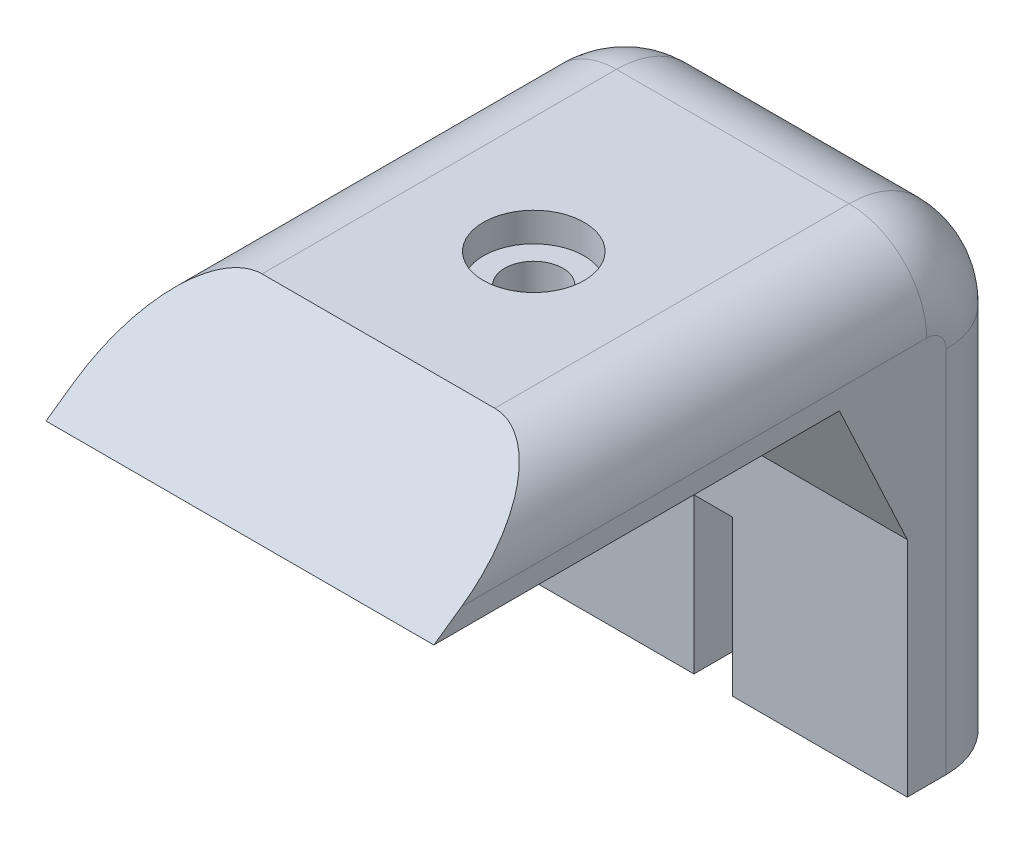
ISO-10303-21;
HEADER;
FILE_DESCRIPTION(('STEP AP214'),'2;1');
FILE_NAME('part.step','',(''),(''),'','','');
FILE_SCHEMA(('AUTOMOTIVE_DESIGN { 1 0 10303 214 1 1 1 1 }'));
ENDSEC;
DATA;
#1=APPLICATION_CONTEXT('core data for automotive mechanical design processes');
#2=APPLICATION_PROTOCOL_DEFINITION('international standard','automotive_design',2000,#1);
#3=PRODUCT_CONTEXT('',#1,'mechanical');
#4=PRODUCT('Part','Part','',(#3));
#5=PRODUCT_RELATED_PRODUCT_CATEGORY('part','',(#4));
#6=PRODUCT_DEFINITION_FORMATION('','',#4);
#7=PRODUCT_DEFINITION_CONTEXT('part definition',#1,'design');
#8=PRODUCT_DEFINITION('design','',#6,#7);
#9=PRODUCT_DEFINITION_SHAPE('','',#8);
#10=(LENGTH_UNIT() NAMED_UNIT(*) SI_UNIT(.MILLI.,.METRE.));
#11=(NAMED_UNIT(*) PLANE_ANGLE_UNIT() SI_UNIT($,.RADIAN.));
#12=(NAMED_UNIT(*) SI_UNIT($,.STERADIAN.) SOLID_ANGLE_UNIT());
#13=UNCERTAINTY_MEASURE_WITH_UNIT(LENGTH_MEASURE(1.E-05),#10,'distance_accuracy_value','');
#14=(GEOMETRIC_REPRESENTATION_CONTEXT(3) GLOBAL_UNCERTAINTY_ASSIGNED_CONTEXT((#13)) GLOBAL_UNIT_ASSIGNED_CONTEXT((#10,
#11,#12)) REPRESENTATION_CONTEXT('',''));
#15=CARTESIAN_POINT('',(0.,0.,0.));
#16=DIRECTION('',(0.,0.,1.));
#17=DIRECTION('',(1.,0.,0.));
#18=AXIS2_PLACEMENT_3D('',#15,#16,#17);
#19=CARTESIAN_POINT('',(9.99999999999999,-19.,-15.1507304969991));
#20=DIRECTION('',(0.,1.,0.));
#21=DIRECTION('',(0.,0.,1.));
#22=AXIS2_PLACEMENT_3D('',#19,#20,#21);
#23=CYLINDRICAL_SURFACE('',#22,1.5);
#24=CARTESIAN_POINT('',(9.99999999999999,0.,-15.1507304969991));
#25=DIRECTION('',(0.,1.,0.));
#26=DIRECTION('',(0.,0.,1.));
#27=AXIS2_PLACEMENT_3D('',#24,#25,#26);
#28=CIRCLE('',#27,1.5);
#29=CARTESIAN_POINT('',(9.99999999999999,0.,-13.6507304969991));
#30=VERTEX_POINT('',#29);
#31=EDGE_CURVE('E362',#30,#30,#28,.T.);
#32=ORIENTED_EDGE('',*,*,#31,.F.);
#33=EDGE_LOOP('',(#32));
#34=FACE_BOUND('',#33,.T.);
#35=CARTESIAN_POINT('',(9.99999999999999,3.49999999999998,-15.1507304969991));
#36=DIRECTION('',(0.,1.,0.));
#37=DIRECTION('',(0.,0.,1.));
#38=AXIS2_PLACEMENT_3D('',#35,#36,#37);
#39=CIRCLE('',#38,1.5);
#40=CARTESIAN_POINT('',(9.99999999999999,3.49999999999998,-13.6507304969991));
#41=VERTEX_POINT('',#40);
#42=EDGE_CURVE('E371',#41,#41,#39,.T.);
#43=ORIENTED_EDGE('',*,*,#42,.T.);
#44=EDGE_LOOP('',(#43));
#45=FACE_BOUND('',#44,.T.);
#46=ADVANCED_FACE('F41',(#34,#45),#23,.F.);
#47=CARTESIAN_POINT('',(20.,-11.,-24.41008643261));
#48=DIRECTION('',(0.,1.,0.));
#49=DIRECTION('',(0.,0.,1.));
#50=AXIS2_PLACEMENT_3D('',#47,#48,#49);
#51=PLANE('',#50);
#52=DIRECTION('',(0.,0.,1.));
#53=VECTOR('',#52,1.);
#54=CARTESIAN_POINT('',(9.,-11.,-30.41008643261));
#55=LINE('',#54,#53);
#56=CARTESIAN_POINT('',(9.,-11.,-30.41008643261));
#57=VERTEX_POINT('',#56);
#58=CARTESIAN_POINT('',(9.,-11.,-24.41008643261));
#59=VERTEX_POINT('',#58);
#60=EDGE_CURVE('E164',#57,#59,#55,.T.);
#61=ORIENTED_EDGE('',*,*,#60,.F.);
#62=DIRECTION('',(-1.,0.,0.));
#63=VECTOR('',#62,1.);
#64=CARTESIAN_POINT('',(20.,-11.,-30.41008643261));
#65=LINE('',#64,#63);
#66=CARTESIAN_POINT('',(11.,-11.,-30.41008643261));
#67=VERTEX_POINT('',#66);
#68=EDGE_CURVE('E180',#67,#57,#65,.T.);
#69=ORIENTED_EDGE('',*,*,#68,.F.);
#70=DIRECTION('',(0.,0.,-1.));
#71=VECTOR('',#70,1.);
#72=CARTESIAN_POINT('',(11.,-11.,-30.41008643261));
#73=LINE('',#72,#71);
#74=CARTESIAN_POINT('',(11.,-11.,-24.41008643261));
#75=VERTEX_POINT('',#74);
#76=EDGE_CURVE('E182',#75,#67,#73,.T.);
#77=ORIENTED_EDGE('',*,*,#76,.F.);
#78=DIRECTION('',(-1.,0.,0.));
#79=VECTOR('',#78,1.);
#80=CARTESIAN_POINT('',(20.,-11.,-24.41008643261));
#81=LINE('',#80,#79);
#82=EDGE_CURVE('E250',#75,#59,#81,.T.);
#83=ORIENTED_EDGE('',*,*,#82,.T.);
#84=EDGE_LOOP('',(#61,#69,#77,#83));
#85=FACE_BOUND('',#84,.T.);
#86=ADVANCED_FACE('F354',(#85),#51,.F.);
#87=CARTESIAN_POINT('',(20.,0.,0.));
#88=DIRECTION('',(0.,1.,0.));
#89=DIRECTION('',(0.,0.,1.));
#90=AXIS2_PLACEMENT_3D('',#87,#88,#89);
#91=PLANE('',#90);
#92=ORIENTED_EDGE('',*,*,#31,.T.);
#93=EDGE_LOOP('',(#92));
#94=FACE_BOUND('',#93,.T.);
#95=DIRECTION('',(0.,0.,-1.));
#96=VECTOR('',#95,1.);
#97=CARTESIAN_POINT('',(0.,0.,0.));
#98=LINE('',#97,#96);
#99=CARTESIAN_POINT('',(0.,0.,0.));
#100=VERTEX_POINT('',#99);
#101=CARTESIAN_POINT('',(0.,0.,-20.9100864326101));
#102=VERTEX_POINT('',#101);
#103=EDGE_CURVE('E211',#100,#102,#98,.T.);
#104=ORIENTED_EDGE('',*,*,#103,.T.);
#105=DIRECTION('',(1.,0.,0.));
#106=VECTOR('',#105,1.);
#107=CARTESIAN_POINT('',(20.,0.,-20.9100864326101));
#108=LINE('',#107,#106);
#109=CARTESIAN_POINT('',(20.,0.,-20.9100864326101));
#110=VERTEX_POINT('',#109);
#111=EDGE_CURVE('E257',#102,#110,#108,.T.);
#112=ORIENTED_EDGE('',*,*,#111,.T.);
#113=DIRECTION('',(0.,0.,-1.));
#114=VECTOR('',#113,1.);
#115=CARTESIAN_POINT('',(20.,0.,0.));
#116=LINE('',#115,#114);
#117=CARTESIAN_POINT('',(20.,0.,0.));
#118=VERTEX_POINT('',#117);
#119=EDGE_CURVE('E212',#118,#110,#116,.T.);
#120=ORIENTED_EDGE('',*,*,#119,.F.);
#121=DIRECTION('',(-1.,0.,0.));
#122=VECTOR('',#121,1.);
#123=CARTESIAN_POINT('',(20.,0.,0.));
#124=LINE('',#123,#122);
#125=EDGE_CURVE('E224',#118,#100,#124,.T.);
#126=ORIENTED_EDGE('',*,*,#125,.T.);
#127=EDGE_LOOP('',(#104,#112,#120,#126));
#128=FACE_BOUND('',#127,.T.);
#129=ADVANCED_FACE('F422',(#94,#128),#91,.F.);
#130=CARTESIAN_POINT('',(20.,0.,-24.41008643261));
#131=DIRECTION('',(0.,0.,-1.));
#132=DIRECTION('',(-1.,0.,0.));
#133=AXIS2_PLACEMENT_3D('',#130,#131,#132);
#134=PLANE('',#133);
#135=DIRECTION('',(0.,-1.,0.));
#136=VECTOR('',#135,1.);
#137=CARTESIAN_POINT('',(20.,0.,-24.41008643261));
#138=LINE('',#137,#136);
#139=CARTESIAN_POINT('',(20.,-7.49999999999994,-24.41008643261));
#140=VERTEX_POINT('',#139);
#141=CARTESIAN_POINT('',(20.,-19.,-24.41008643261));
#142=VERTEX_POINT('',#141);
#143=EDGE_CURVE('E216',#140,#142,#138,.T.);
#144=ORIENTED_EDGE('',*,*,#143,.F.);
#145=DIRECTION('',(-1.,0.,0.));
#146=VECTOR('',#145,1.);
#147=CARTESIAN_POINT('',(0.,-7.49999999999994,-24.41008643261));
#148=LINE('',#147,#146);
#149=CARTESIAN_POINT('',(0.,-7.49999999999994,-24.41008643261));
#150=VERTEX_POINT('',#149);
#151=EDGE_CURVE('E253',#140,#150,#148,.T.);
#152=ORIENTED_EDGE('',*,*,#151,.T.);
#153=DIRECTION('',(0.,-1.,0.));
#154=VECTOR('',#153,1.);
#155=CARTESIAN_POINT('',(0.,0.,-24.41008643261));
#156=LINE('',#155,#154);
#157=CARTESIAN_POINT('',(0.,-19.,-24.41008643261));
#158=VERTEX_POINT('',#157);
#159=EDGE_CURVE('E228',#150,#158,#156,.T.);
#160=ORIENTED_EDGE('',*,*,#159,.T.);
#161=DIRECTION('',(-1.,0.,0.));
#162=VECTOR('',#161,1.);
#163=CARTESIAN_POINT('',(0.,-19.,-24.41008643261));
#164=LINE('',#163,#162);
#165=CARTESIAN_POINT('',(9.,-19.,-24.41008643261));
#166=VERTEX_POINT('',#165);
#167=EDGE_CURVE('E175',#166,#158,#164,.T.);
#168=ORIENTED_EDGE('',*,*,#167,.F.);
#169=DIRECTION('',(0.,1.,0.));
#170=VECTOR('',#169,1.);
#171=CARTESIAN_POINT('',(9.,-19.,-24.41008643261));
#172=LINE('',#171,#170);
#173=EDGE_CURVE('E172',#166,#59,#172,.T.);
#174=ORIENTED_EDGE('',*,*,#173,.T.);
#175=ORIENTED_EDGE('',*,*,#82,.F.);
#176=DIRECTION('',(0.,1.,0.));
#177=VECTOR('',#176,1.);
#178=CARTESIAN_POINT('',(11.,-19.,-24.41008643261));
#179=LINE('',#178,#177);
#180=CARTESIAN_POINT('',(11.,-19.,-24.41008643261));
#181=VERTEX_POINT('',#180);
#182=EDGE_CURVE('E207',#181,#75,#179,.T.);
#183=ORIENTED_EDGE('',*,*,#182,.F.);
#184=DIRECTION('',(-1.,0.,0.));
#185=VECTOR('',#184,1.);
#186=CARTESIAN_POINT('',(20.,-19.,-24.41008643261));
#187=LINE('',#186,#185);
#188=EDGE_CURVE('E195',#142,#181,#187,.T.);
#189=ORIENTED_EDGE('',*,*,#188,.F.);
#190=EDGE_LOOP('',(#144,#152,#160,#168,#174,#175,#183,#189));
#191=FACE_BOUND('',#190,.T.);
#192=ADVANCED_FACE('F347',(#191),#134,.F.);
#193=CARTESIAN_POINT('',(20.,0.,-30.41008643261));
#194=DIRECTION('',(0.,0.,1.));
#195=DIRECTION('',(1.,0.,0.));
#196=AXIS2_PLACEMENT_3D('',#193,#194,#195);
#197=PLANE('',#196);
#198=DIRECTION('',(1.,0.,0.));
#199=VECTOR('',#198,1.);
#200=CARTESIAN_POINT('',(0.,-19.,-30.41008643261));
#201=LINE('',#200,#199);
#202=CARTESIAN_POINT('',(4.,-19.,-30.41008643261));
#203=VERTEX_POINT('',#202);
#204=CARTESIAN_POINT('',(9.,-19.,-30.41008643261));
#205=VERTEX_POINT('',#204);
#206=EDGE_CURVE('E155',#203,#205,#201,.T.);
#207=ORIENTED_EDGE('',*,*,#206,.F.);
#208=DIRECTION('',(0.,1.,0.));
#209=VECTOR('',#208,1.);
#210=CARTESIAN_POINT('',(4.,0.,-30.41008643261));
#211=LINE('',#210,#209);
#212=CARTESIAN_POINT('',(4.,0.,-30.41008643261));
#213=VERTEX_POINT('',#212);
#214=EDGE_CURVE('E306',#203,#213,#211,.T.);
#215=ORIENTED_EDGE('',*,*,#214,.T.);
#216=DIRECTION('',(-1.,0.,0.));
#217=VECTOR('',#216,1.);
#218=CARTESIAN_POINT('',(20.,0.,-30.41008643261));
#219=LINE('',#218,#217);
#220=CARTESIAN_POINT('',(16.,0.,-30.41008643261));
#221=VERTEX_POINT('',#220);
#222=EDGE_CURVE('E244',#221,#213,#219,.T.);
#223=ORIENTED_EDGE('',*,*,#222,.F.);
#224=DIRECTION('',(0.,1.,0.));
#225=VECTOR('',#224,1.);
#226=CARTESIAN_POINT('',(16.,0.,-30.41008643261));
#227=LINE('',#226,#225);
#228=CARTESIAN_POINT('',(16.,-19.,-30.41008643261));
#229=VERTEX_POINT('',#228);
#230=EDGE_CURVE('E66',#221,#229,#227,.F.);
#231=ORIENTED_EDGE('',*,*,#230,.T.);
#232=DIRECTION('',(1.,0.,0.));
#233=VECTOR('',#232,1.);
#234=CARTESIAN_POINT('',(20.,-19.,-30.41008643261));
#235=LINE('',#234,#233);
#236=CARTESIAN_POINT('',(11.,-19.,-30.41008643261));
#237=VERTEX_POINT('',#236);
#238=EDGE_CURVE('E201',#237,#229,#235,.T.);
#239=ORIENTED_EDGE('',*,*,#238,.F.);
#240=DIRECTION('',(0.,1.,0.));
#241=VECTOR('',#240,1.);
#242=CARTESIAN_POINT('',(11.,-19.,-30.41008643261));
#243=LINE('',#242,#241);
#244=EDGE_CURVE('E203',#237,#67,#243,.T.);
#245=ORIENTED_EDGE('',*,*,#244,.T.);
#246=ORIENTED_EDGE('',*,*,#68,.T.);
#247=DIRECTION('',(0.,1.,0.));
#248=VECTOR('',#247,1.);
#249=CARTESIAN_POINT('',(9.,-19.,-30.41008643261));
#250=LINE('',#249,#248);
#251=EDGE_CURVE('E170',#205,#57,#250,.T.);
#252=ORIENTED_EDGE('',*,*,#251,.F.);
#253=EDGE_LOOP('',(#207,#215,#223,#231,#239,#245,#246,#252));
#254=FACE_BOUND('',#253,.T.);
#255=ADVANCED_FACE('F178',(#254),#197,.F.);
#256=CARTESIAN_POINT('',(20.,0.,-25.41008643261));
#257=DIRECTION('',(-1.,0.,0.));
#258=DIRECTION('',(0.,0.,1.));
#259=AXIS2_PLACEMENT_3D('',#256,#257,#258);
#260=CYLINDRICAL_SURFACE('',#259,5.);
#261=ORIENTED_EDGE('',*,*,#222,.T.);
#262=CARTESIAN_POINT('',(4.,0.,-25.41008643261));
#263=DIRECTION('',(-1.,0.,0.));
#264=DIRECTION('',(0.,0.,1.));
#265=AXIS2_PLACEMENT_3D('',#262,#263,#264);
#266=CIRCLE('',#265,5.);
#267=CARTESIAN_POINT('',(4.,5.,-25.41008643261));
#268=VERTEX_POINT('',#267);
#269=EDGE_CURVE('E291',#213,#268,#266,.F.);
#270=ORIENTED_EDGE('',*,*,#269,.T.);
#271=DIRECTION('',(-1.,0.,0.));
#272=VECTOR('',#271,1.);
#273=CARTESIAN_POINT('',(20.,5.,-25.41008643261));
#274=LINE('',#273,#272);
#275=CARTESIAN_POINT('',(16.,5.,-25.41008643261));
#276=VERTEX_POINT('',#275);
#277=EDGE_CURVE('E240',#276,#268,#274,.T.);
#278=ORIENTED_EDGE('',*,*,#277,.F.);
#279=CARTESIAN_POINT('',(16.,0.,-25.41008643261));
#280=DIRECTION('',(-1.,0.,0.));
#281=DIRECTION('',(0.,0.,1.));
#282=AXIS2_PLACEMENT_3D('',#279,#280,#281);
#283=CIRCLE('',#282,5.);
#284=EDGE_CURVE('E288',#276,#221,#283,.T.);
#285=ORIENTED_EDGE('',*,*,#284,.T.);
#286=EDGE_LOOP('',(#261,#270,#278,#285));
#287=FACE_BOUND('',#286,.T.);
#288=ADVANCED_FACE('F400',(#287),#260,.T.);
#289=CARTESIAN_POINT('',(20.,5.,-7.14074003371055));
#290=DIRECTION('',(0.,-1.,0.));
#291=DIRECTION('',(0.,0.,-1.));
#292=AXIS2_PLACEMENT_3D('',#289,#290,#291);
#293=PLANE('',#292);
#294=CARTESIAN_POINT('',(9.99999999999999,4.99999999999998,-15.1507304969991));
#295=DIRECTION('',(0.,1.,0.));
#296=DIRECTION('',(0.,0.,1.));
#297=AXIS2_PLACEMENT_3D('',#294,#295,#296);
#298=CIRCLE('',#297,2.6);
#299=CARTESIAN_POINT('',(9.99999999999999,4.99999999999998,-12.5507304969991));
#300=VERTEX_POINT('',#299);
#301=EDGE_CURVE('E318',#300,#300,#298,.T.);
#302=ORIENTED_EDGE('',*,*,#301,.F.);
#303=EDGE_LOOP('',(#302));
#304=FACE_BOUND('',#303,.T.);
#305=ORIENTED_EDGE('',*,*,#277,.T.);
#306=DIRECTION('',(0.,0.,1.));
#307=VECTOR('',#306,1.);
#308=CARTESIAN_POINT('',(4.,5.,-7.14074003371055));
#309=LINE('',#308,#307);
#310=CARTESIAN_POINT('',(4.,5.,-7.14074003371055));
#311=VERTEX_POINT('',#310);
#312=EDGE_CURVE('E269',#268,#311,#309,.T.);
#313=ORIENTED_EDGE('',*,*,#312,.T.);
#314=DIRECTION('',(-1.,0.,0.));
#315=VECTOR('',#314,1.);
#316=CARTESIAN_POINT('',(20.,5.,-7.14074003371055));
#317=LINE('',#316,#315);
#318=CARTESIAN_POINT('',(16.,5.,-7.14074003371055));
#319=VERTEX_POINT('',#318);
#320=EDGE_CURVE('E236',#319,#311,#317,.T.);
#321=ORIENTED_EDGE('',*,*,#320,.F.);
#322=DIRECTION('',(0.,0.,1.));
#323=VECTOR('',#322,1.);
#324=CARTESIAN_POINT('',(16.,5.,-7.14074003371055));
#325=LINE('',#324,#323);
#326=EDGE_CURVE('E266',#319,#276,#325,.F.);
#327=ORIENTED_EDGE('',*,*,#326,.T.);
#328=EDGE_LOOP('',(#305,#313,#321,#327));
#329=FACE_BOUND('',#328,.T.);
#330=ADVANCED_FACE('F396',(#304,#329),#293,.F.);
#331=CARTESIAN_POINT('',(20.,0.,0.));
#332=DIRECTION('',(0.,-0.819152044288991,-0.573576436351047));
#333=DIRECTION('',(0.,0.573576436351047,-0.819152044288991));
#334=AXIS2_PLACEMENT_3D('',#331,#332,#333);
#335=PLANE('',#334);
#336=ORIENTED_EDGE('',*,*,#320,.T.);
#337=CARTESIAN_POINT('',(4.,1.,-1.42814800674211));
#338=DIRECTION('',(0.,-0.819152044288991,-0.573576436351047));
#339=DIRECTION('',(0.,0.573576436351047,-0.819152044288991));
#340=AXIS2_PLACEMENT_3D('',#337,#338,#339);
#341=ELLIPSE('',#340,6.97378718248438,4.);
#342=CARTESIAN_POINT('',(0.,1.,-1.42814800674211));
#343=VERTEX_POINT('',#342);
#344=EDGE_CURVE('E276',#311,#343,#341,.F.);
#345=ORIENTED_EDGE('',*,*,#344,.T.);
#346=DIRECTION('',(0.,-0.573576436351047,0.819152044288991));
#347=VECTOR('',#346,1.);
#348=CARTESIAN_POINT('',(0.,0.,0.));
#349=LINE('',#348,#347);
#350=EDGE_CURVE('E217',#343,#100,#349,.T.);
#351=ORIENTED_EDGE('',*,*,#350,.T.);
#352=ORIENTED_EDGE('',*,*,#125,.F.);
#353=DIRECTION('',(0.,-0.573576436351047,0.819152044288991));
#354=VECTOR('',#353,1.);
#355=CARTESIAN_POINT('',(20.,0.,0.));
#356=LINE('',#355,#354);
#357=CARTESIAN_POINT('',(20.,1.,-1.42814800674211));
#358=VERTEX_POINT('',#357);
#359=EDGE_CURVE('E221',#358,#118,#356,.T.);
#360=ORIENTED_EDGE('',*,*,#359,.F.);
#361=CARTESIAN_POINT('',(16.,1.,-1.42814800674211));
#362=DIRECTION('',(0.,-0.819152044288991,-0.573576436351047));
#363=DIRECTION('',(0.,-0.573576436351047,0.819152044288991));
#364=AXIS2_PLACEMENT_3D('',#361,#362,#363);
#365=ELLIPSE('',#364,6.97378718248438,4.);
#366=EDGE_CURVE('E273',#358,#319,#365,.F.);
#367=ORIENTED_EDGE('',*,*,#366,.T.);
#368=EDGE_LOOP('',(#336,#345,#351,#352,#360,#367));
#369=FACE_BOUND('',#368,.T.);
#370=ADVANCED_FACE('F399',(#369),#335,.F.);
#371=CARTESIAN_POINT('',(20.,0.,-25.41008643261));
#372=DIRECTION('',(-1.,0.,0.));
#373=DIRECTION('',(0.,0.,1.));
#374=AXIS2_PLACEMENT_3D('',#371,#372,#373);
#375=PLANE('',#374);
#376=CARTESIAN_POINT('',(20.,0.,-25.41008643261));
#377=DIRECTION('',(-1.,0.,0.));
#378=DIRECTION('',(0.,0.,1.));
#379=AXIS2_PLACEMENT_3D('',#376,#377,#378);
#380=CIRCLE('',#379,1.);
#381=CARTESIAN_POINT('',(20.,0.,-26.41008643261));
#382=VERTEX_POINT('',#381);
#383=CARTESIAN_POINT('',(20.,1.,-25.41008643261));
#384=VERTEX_POINT('',#383);
#385=EDGE_CURVE('E297',#382,#384,#380,.F.);
#386=ORIENTED_EDGE('',*,*,#385,.T.);
#387=DIRECTION('',(0.,0.,1.));
#388=VECTOR('',#387,1.);
#389=CARTESIAN_POINT('',(20.,1.,-25.41008643261));
#390=LINE('',#389,#388);
#391=EDGE_CURVE('E300',#384,#358,#390,.T.);
#392=ORIENTED_EDGE('',*,*,#391,.T.);
#393=ORIENTED_EDGE('',*,*,#359,.T.);
#394=ORIENTED_EDGE('',*,*,#119,.T.);
#395=DIRECTION('',(0.,0.906183139995265,0.422885465331126));
#396=VECTOR('',#395,1.);
#397=CARTESIAN_POINT('',(20.,-1.72445255474453,-21.7148309581575));
#398=LINE('',#397,#396);
#399=EDGE_CURVE('E263',#110,#140,#398,.F.);
#400=ORIENTED_EDGE('',*,*,#399,.T.);
#401=ORIENTED_EDGE('',*,*,#143,.T.);
#402=DIRECTION('',(0.,0.,1.));
#403=VECTOR('',#402,1.);
#404=CARTESIAN_POINT('',(20.,-19.,-30.41008643261));
#405=LINE('',#404,#403);
#406=CARTESIAN_POINT('',(20.,-19.,-26.41008643261));
#407=VERTEX_POINT('',#406);
#408=EDGE_CURVE('E187',#407,#142,#405,.T.);
#409=ORIENTED_EDGE('',*,*,#408,.F.);
#410=DIRECTION('',(0.,1.,0.));
#411=VECTOR('',#410,1.);
#412=CARTESIAN_POINT('',(20.,0.,-26.41008643261));
#413=LINE('',#412,#411);
#414=EDGE_CURVE('E294',#407,#382,#413,.T.);
#415=ORIENTED_EDGE('',*,*,#414,.T.);
#416=EDGE_LOOP('',(#386,#392,#393,#394,#400,#401,#409,#415));
#417=FACE_BOUND('',#416,.T.);
#418=ADVANCED_FACE('F340',(#417),#375,.F.);
#419=CARTESIAN_POINT('',(0.,0.,-25.41008643261));
#420=DIRECTION('',(-1.,0.,0.));
#421=DIRECTION('',(0.,0.,1.));
#422=AXIS2_PLACEMENT_3D('',#419,#420,#421);
#423=PLANE('',#422);
#424=ORIENTED_EDGE('',*,*,#350,.F.);
#425=DIRECTION('',(0.,0.,1.));
#426=VECTOR('',#425,1.);
#427=CARTESIAN_POINT('',(0.,1.,-25.41008643261));
#428=LINE('',#427,#426);
#429=CARTESIAN_POINT('',(0.,1.,-25.41008643261));
#430=VERTEX_POINT('',#429);
#431=EDGE_CURVE('E285',#343,#430,#428,.F.);
#432=ORIENTED_EDGE('',*,*,#431,.T.);
#433=CARTESIAN_POINT('',(0.,0.,-25.41008643261));
#434=DIRECTION('',(-1.,0.,0.));
#435=DIRECTION('',(0.,0.,1.));
#436=AXIS2_PLACEMENT_3D('',#433,#434,#435);
#437=CIRCLE('',#436,1.);
#438=CARTESIAN_POINT('',(0.,0.,-26.41008643261));
#439=VERTEX_POINT('',#438);
#440=EDGE_CURVE('E282',#430,#439,#437,.T.);
#441=ORIENTED_EDGE('',*,*,#440,.T.);
#442=DIRECTION('',(0.,1.,0.));
#443=VECTOR('',#442,1.);
#444=CARTESIAN_POINT('',(0.,-19.,-26.41008643261));
#445=LINE('',#444,#443);
#446=CARTESIAN_POINT('',(0.,-19.,-26.41008643261));
#447=VERTEX_POINT('',#446);
#448=EDGE_CURVE('E279',#439,#447,#445,.F.);
#449=ORIENTED_EDGE('',*,*,#448,.T.);
#450=DIRECTION('',(0.,0.,-1.));
#451=VECTOR('',#450,1.);
#452=CARTESIAN_POINT('',(0.,-19.,-30.41008643261));
#453=LINE('',#452,#451);
#454=EDGE_CURVE('E189',#158,#447,#453,.T.);
#455=ORIENTED_EDGE('',*,*,#454,.F.);
#456=ORIENTED_EDGE('',*,*,#159,.F.);
#457=DIRECTION('',(0.,-0.906183139995265,-0.422885465331126));
#458=VECTOR('',#457,1.);
#459=CARTESIAN_POINT('',(0.,-7.49999999999994,-24.41008643261));
#460=LINE('',#459,#458);
#461=EDGE_CURVE('E260',#150,#102,#460,.F.);
#462=ORIENTED_EDGE('',*,*,#461,.T.);
#463=ORIENTED_EDGE('',*,*,#103,.F.);
#464=EDGE_LOOP('',(#424,#432,#441,#449,#455,#456,#462,#463));
#465=FACE_BOUND('',#464,.T.);
#466=ADVANCED_FACE('F419',(#465),#423,.T.);
#467=CARTESIAN_POINT('',(11.,-19.,-30.41008643261));
#468=DIRECTION('',(1.,0.,0.));
#469=DIRECTION('',(0.,0.,-1.));
#470=AXIS2_PLACEMENT_3D('',#467,#468,#469);
#471=PLANE('',#470);
#472=ORIENTED_EDGE('',*,*,#76,.T.);
#473=ORIENTED_EDGE('',*,*,#244,.F.);
#474=DIRECTION('',(0.,0.,-1.));
#475=VECTOR('',#474,1.);
#476=CARTESIAN_POINT('',(11.,-19.,-30.41008643261));
#477=LINE('',#476,#475);
#478=EDGE_CURVE('E198',#181,#237,#477,.T.);
#479=ORIENTED_EDGE('',*,*,#478,.F.);
#480=ORIENTED_EDGE('',*,*,#182,.T.);
#481=EDGE_LOOP('',(#472,#473,#479,#480));
#482=FACE_BOUND('',#481,.T.);
#483=ADVANCED_FACE('F352',(#482),#471,.F.);
#484=CARTESIAN_POINT('',(0.,-19.,0.));
#485=DIRECTION('',(0.,-1.,0.));
#486=DIRECTION('',(0.,0.,-1.));
#487=AXIS2_PLACEMENT_3D('',#484,#485,#486);
#488=PLANE('',#487);
#489=ORIENTED_EDGE('',*,*,#238,.T.);
#490=CARTESIAN_POINT('',(16.,-19.,-26.41008643261));
#491=DIRECTION('',(0.,-1.,0.));
#492=DIRECTION('',(0.,0.,-1.));
#493=AXIS2_PLACEMENT_3D('',#490,#491,#492);
#494=CIRCLE('',#493,4.);
#495=EDGE_CURVE('E11',#229,#407,#494,.T.);
#496=ORIENTED_EDGE('',*,*,#495,.T.);
#497=ORIENTED_EDGE('',*,*,#408,.T.);
#498=ORIENTED_EDGE('',*,*,#188,.T.);
#499=ORIENTED_EDGE('',*,*,#478,.T.);
#500=EDGE_LOOP('',(#489,#496,#497,#498,#499));
#501=FACE_BOUND('',#500,.T.);
#502=ADVANCED_FACE('F338',(#501),#488,.T.);
#503=CARTESIAN_POINT('',(9.,-19.,-30.41008643261));
#504=DIRECTION('',(-1.,0.,0.));
#505=DIRECTION('',(0.,0.,1.));
#506=AXIS2_PLACEMENT_3D('',#503,#504,#505);
#507=PLANE('',#506);
#508=ORIENTED_EDGE('',*,*,#60,.T.);
#509=ORIENTED_EDGE('',*,*,#173,.F.);
#510=DIRECTION('',(0.,0.,1.));
#511=VECTOR('',#510,1.);
#512=CARTESIAN_POINT('',(9.,-19.,-30.41008643261));
#513=LINE('',#512,#511);
#514=EDGE_CURVE('E159',#205,#166,#513,.T.);
#515=ORIENTED_EDGE('',*,*,#514,.F.);
#516=ORIENTED_EDGE('',*,*,#251,.T.);
#517=EDGE_LOOP('',(#508,#509,#515,#516));
#518=FACE_BOUND('',#517,.T.);
#519=ADVANCED_FACE('F169',(#518),#507,.F.);
#520=CARTESIAN_POINT('',(0.,-19.,0.));
#521=DIRECTION('',(0.,-1.,0.));
#522=DIRECTION('',(0.,0.,-1.));
#523=AXIS2_PLACEMENT_3D('',#520,#521,#522);
#524=PLANE('',#523);
#525=ORIENTED_EDGE('',*,*,#454,.T.);
#526=CARTESIAN_POINT('',(4.,-19.,-26.41008643261));
#527=DIRECTION('',(0.,-1.,0.));
#528=DIRECTION('',(0.,0.,-1.));
#529=AXIS2_PLACEMENT_3D('',#526,#527,#528);
#530=CIRCLE('',#529,4.);
#531=EDGE_CURVE('E51',#447,#203,#530,.T.);
#532=ORIENTED_EDGE('',*,*,#531,.T.);
#533=ORIENTED_EDGE('',*,*,#206,.T.);
#534=ORIENTED_EDGE('',*,*,#514,.T.);
#535=ORIENTED_EDGE('',*,*,#167,.T.);
#536=EDGE_LOOP('',(#525,#532,#533,#534,#535));
#537=FACE_BOUND('',#536,.T.);
#538=ADVANCED_FACE('F157',(#537),#524,.T.);
#539=CARTESIAN_POINT('',(20.,-7.49999999999994,-24.41008643261));
#540=DIRECTION('',(0.,-0.422885465331126,0.906183139995265));
#541=DIRECTION('',(1.,0.,0.));
#542=AXIS2_PLACEMENT_3D('',#539,#540,#541);
#543=PLANE('',#542);
#544=ORIENTED_EDGE('',*,*,#399,.F.);
#545=ORIENTED_EDGE('',*,*,#111,.F.);
#546=ORIENTED_EDGE('',*,*,#461,.F.);
#547=ORIENTED_EDGE('',*,*,#151,.F.);
#548=EDGE_LOOP('',(#544,#545,#546,#547));
#549=FACE_BOUND('',#548,.T.);
#550=ADVANCED_FACE('F392',(#549),#543,.T.);
#551=CARTESIAN_POINT('',(9.99999999999999,3.49999999999998,-15.1507304969991));
#552=DIRECTION('',(0.,1.,0.));
#553=DIRECTION('',(0.,0.,1.));
#554=AXIS2_PLACEMENT_3D('',#551,#552,#553);
#555=CYLINDRICAL_SURFACE('',#554,2.6);
#556=CARTESIAN_POINT('',(9.99999999999999,3.49999999999998,-15.1507304969991));
#557=DIRECTION('',(0.,1.,0.));
#558=DIRECTION('',(0.,0.,1.));
#559=AXIS2_PLACEMENT_3D('',#556,#557,#558);
#560=CIRCLE('',#559,2.6);
#561=CARTESIAN_POINT('',(9.99999999999999,3.49999999999998,-12.5507304969991));
#562=VERTEX_POINT('',#561);
#563=EDGE_CURVE('E365',#562,#562,#560,.T.);
#564=ORIENTED_EDGE('',*,*,#563,.F.);
#565=EDGE_LOOP('',(#564));
#566=FACE_BOUND('',#565,.T.);
#567=ORIENTED_EDGE('',*,*,#301,.T.);
#568=EDGE_LOOP('',(#567));
#569=FACE_BOUND('',#568,.T.);
#570=ADVANCED_FACE('F386',(#566,#569),#555,.F.);
#571=CARTESIAN_POINT('',(0.,3.5,0.));
#572=DIRECTION('',(0.,1.,0.));
#573=DIRECTION('',(0.,0.,1.));
#574=AXIS2_PLACEMENT_3D('',#571,#572,#573);
#575=PLANE('',#574);
#576=ORIENTED_EDGE('',*,*,#42,.F.);
#577=EDGE_LOOP('',(#576));
#578=FACE_BOUND('',#577,.T.);
#579=ORIENTED_EDGE('',*,*,#563,.T.);
#580=EDGE_LOOP('',(#579));
#581=FACE_BOUND('',#580,.T.);
#582=ADVANCED_FACE('F382',(#578,#581),#575,.T.);
#583=CARTESIAN_POINT('',(4.,0.,-26.41008643261));
#584=DIRECTION('',(0.,-1.,0.));
#585=DIRECTION('',(0.,0.,-1.));
#586=AXIS2_PLACEMENT_3D('',#583,#584,#585);
#587=CYLINDRICAL_SURFACE('',#586,4.);
#588=ORIENTED_EDGE('',*,*,#531,.F.);
#589=ORIENTED_EDGE('',*,*,#448,.F.);
#590=CARTESIAN_POINT('',(4.,0.,-26.41008643261));
#591=DIRECTION('',(0.,1.,0.));
#592=DIRECTION('',(-1.,0.,0.));
#593=AXIS2_PLACEMENT_3D('',#590,#591,#592);
#594=CIRCLE('',#593,4.);
#595=EDGE_CURVE('E315',#213,#439,#594,.T.);
#596=ORIENTED_EDGE('',*,*,#595,.F.);
#597=ORIENTED_EDGE('',*,*,#214,.F.);
#598=EDGE_LOOP('',(#588,#589,#596,#597));
#599=FACE_BOUND('',#598,.T.);
#600=ADVANCED_FACE('F385',(#599),#587,.T.);
#601=CARTESIAN_POINT('',(4.,0.,-25.41008643261));
#602=DIRECTION('',(-1.,0.,0.));
#603=DIRECTION('',(0.,0.,1.));
#604=AXIS2_PLACEMENT_3D('',#601,#602,#603);
#605=DEGENERATE_TOROIDAL_SURFACE('',#604,1.,4.,.T.);
#606=ORIENTED_EDGE('',*,*,#595,.T.);
#607=ORIENTED_EDGE('',*,*,#440,.F.);
#608=CARTESIAN_POINT('',(4.,1.,-25.41008643261));
#609=DIRECTION('',(0.,0.,1.));
#610=DIRECTION('',(1.,0.,0.));
#611=AXIS2_PLACEMENT_3D('',#608,#609,#610);
#612=CIRCLE('',#611,4.);
#613=EDGE_CURVE('E311',#268,#430,#612,.T.);
#614=ORIENTED_EDGE('',*,*,#613,.F.);
#615=ORIENTED_EDGE('',*,*,#269,.F.);
#616=EDGE_LOOP('',(#606,#607,#614,#615));
#617=FACE_BOUND('',#616,.T.);
#618=ADVANCED_FACE('F410',(#617),#605,.T.);
#619=CARTESIAN_POINT('',(4.,1.,-7.14074003371055));
#620=DIRECTION('',(0.,0.,-1.));
#621=DIRECTION('',(0.,1.,0.));
#622=AXIS2_PLACEMENT_3D('',#619,#620,#621);
#623=CYLINDRICAL_SURFACE('',#622,4.);
#624=ORIENTED_EDGE('',*,*,#613,.T.);
#625=ORIENTED_EDGE('',*,*,#431,.F.);
#626=ORIENTED_EDGE('',*,*,#344,.F.);
#627=ORIENTED_EDGE('',*,*,#312,.F.);
#628=EDGE_LOOP('',(#624,#625,#626,#627));
#629=FACE_BOUND('',#628,.T.);
#630=ADVANCED_FACE('F413',(#629),#623,.T.);
#631=CARTESIAN_POINT('',(16.,0.,-26.41008643261));
#632=DIRECTION('',(0.,1.,0.));
#633=DIRECTION('',(0.,0.,1.));
#634=AXIS2_PLACEMENT_3D('',#631,#632,#633);
#635=CYLINDRICAL_SURFACE('',#634,4.);
#636=ORIENTED_EDGE('',*,*,#495,.F.);
#637=ORIENTED_EDGE('',*,*,#230,.F.);
#638=CARTESIAN_POINT('',(16.,0.,-26.41008643261));
#639=DIRECTION('',(0.,1.,0.));
#640=DIRECTION('',(0.,0.,1.));
#641=AXIS2_PLACEMENT_3D('',#638,#639,#640);
#642=CIRCLE('',#641,4.);
#643=EDGE_CURVE('E45',#382,#221,#642,.T.);
#644=ORIENTED_EDGE('',*,*,#643,.F.);
#645=ORIENTED_EDGE('',*,*,#414,.F.);
#646=EDGE_LOOP('',(#636,#637,#644,#645));
#647=FACE_BOUND('',#646,.T.);
#648=ADVANCED_FACE('F43',(#647),#635,.T.);
#649=CARTESIAN_POINT('',(16.,0.,-25.41008643261));
#650=DIRECTION('',(-1.,0.,0.));
#651=DIRECTION('',(0.,0.,1.));
#652=AXIS2_PLACEMENT_3D('',#649,#650,#651);
#653=DEGENERATE_TOROIDAL_SURFACE('',#652,1.,4.,.T.);
#654=ORIENTED_EDGE('',*,*,#643,.T.);
#655=ORIENTED_EDGE('',*,*,#284,.F.);
#656=CARTESIAN_POINT('',(16.,1.,-25.41008643261));
#657=DIRECTION('',(0.,0.,1.));
#658=DIRECTION('',(1.,0.,0.));
#659=AXIS2_PLACEMENT_3D('',#656,#657,#658);
#660=CIRCLE('',#659,4.);
#661=EDGE_CURVE('E319',#384,#276,#660,.T.);
#662=ORIENTED_EDGE('',*,*,#661,.F.);
#663=ORIENTED_EDGE('',*,*,#385,.F.);
#664=EDGE_LOOP('',(#654,#655,#662,#663));
#665=FACE_BOUND('',#664,.T.);
#666=ADVANCED_FACE('F332',(#665),#653,.T.);
#667=CARTESIAN_POINT('',(16.,1.,-25.41008643261));
#668=DIRECTION('',(0.,0.,1.));
#669=DIRECTION('',(0.,-1.,0.));
#670=AXIS2_PLACEMENT_3D('',#667,#668,#669);
#671=CYLINDRICAL_SURFACE('',#670,4.);
#672=ORIENTED_EDGE('',*,*,#661,.T.);
#673=ORIENTED_EDGE('',*,*,#326,.F.);
#674=ORIENTED_EDGE('',*,*,#366,.F.);
#675=ORIENTED_EDGE('',*,*,#391,.F.);
#676=EDGE_LOOP('',(#672,#673,#674,#675));
#677=FACE_BOUND('',#676,.T.);
#678=ADVANCED_FACE('F530',(#677),#671,.T.);
#679=CLOSED_SHELL('',(#46,#86,#129,#192,#255,#288,#330,#370,#418,#466,#483,#502,#519,#538,#550,
#570,#582,#600,#618,#630,#648,#666,#678));
#680=MANIFOLD_SOLID_BREP('B2',#679);
#681=ADVANCED_BREP_SHAPE_REPRESENTATION('',(#18,#680),#14);
#682=SHAPE_DEFINITION_REPRESENTATION(#9,#681);
ENDSEC;
END-ISO-10303-21;
